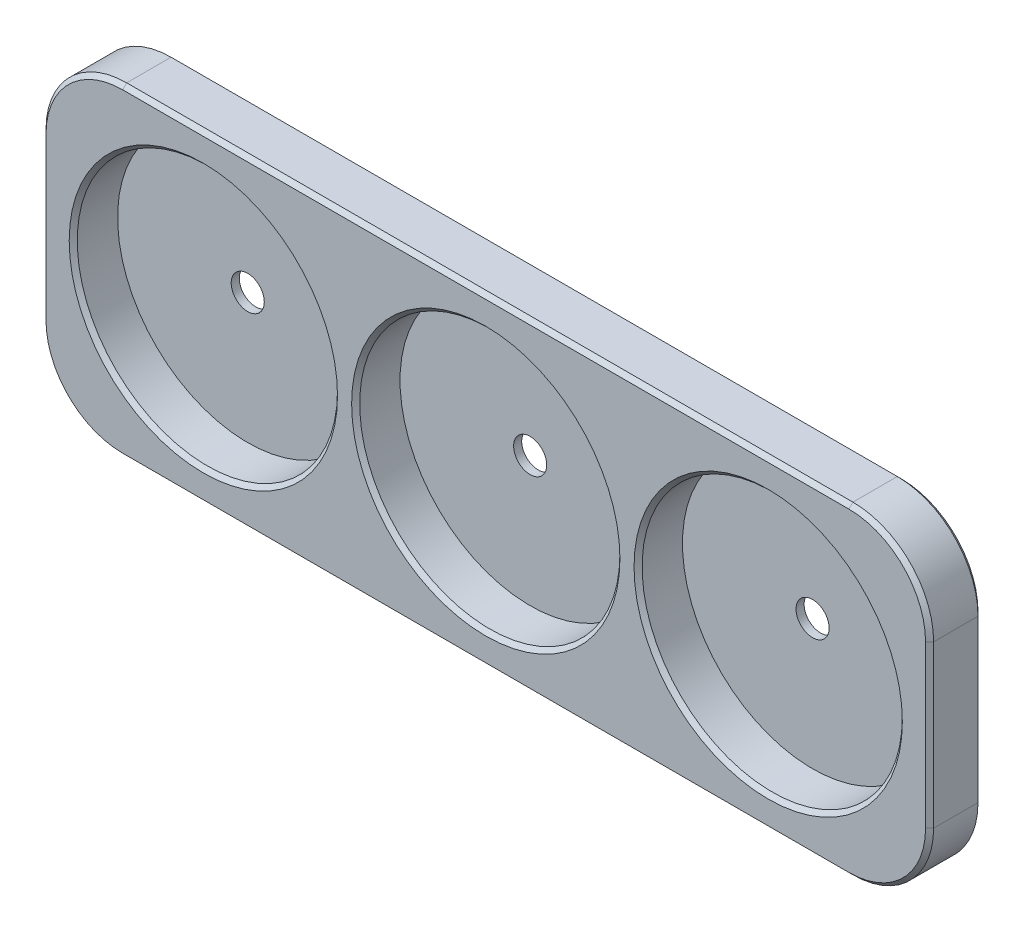
ISO-10303-21;
HEADER;
FILE_DESCRIPTION(('STEP AP214'),'2;1');
FILE_NAME('part.step','',(''),(''),'','','');
FILE_SCHEMA(('AUTOMOTIVE_DESIGN { 1 0 10303 214 1 1 1 1 }'));
ENDSEC;
DATA;
#1=APPLICATION_CONTEXT('core data for automotive mechanical design processes');
#2=APPLICATION_PROTOCOL_DEFINITION('international standard','automotive_design',2000,#1);
#3=PRODUCT_CONTEXT('',#1,'mechanical');
#4=PRODUCT('Part','Part','',(#3));
#5=PRODUCT_RELATED_PRODUCT_CATEGORY('part','',(#4));
#6=PRODUCT_DEFINITION_FORMATION('','',#4);
#7=PRODUCT_DEFINITION_CONTEXT('part definition',#1,'design');
#8=PRODUCT_DEFINITION('design','',#6,#7);
#9=PRODUCT_DEFINITION_SHAPE('','',#8);
#10=(LENGTH_UNIT() NAMED_UNIT(*) SI_UNIT(.MILLI.,.METRE.));
#11=(NAMED_UNIT(*) PLANE_ANGLE_UNIT() SI_UNIT($,.RADIAN.));
#12=(NAMED_UNIT(*) SI_UNIT($,.STERADIAN.) SOLID_ANGLE_UNIT());
#13=UNCERTAINTY_MEASURE_WITH_UNIT(LENGTH_MEASURE(1.E-05),#10,'distance_accuracy_value','');
#14=(GEOMETRIC_REPRESENTATION_CONTEXT(3) GLOBAL_UNCERTAINTY_ASSIGNED_CONTEXT((#13)) GLOBAL_UNIT_ASSIGNED_CONTEXT((#10,
#11,#12)) REPRESENTATION_CONTEXT('',''));
#15=CARTESIAN_POINT('',(0.,0.,0.));
#16=DIRECTION('',(0.,0.,1.));
#17=DIRECTION('',(1.,0.,0.));
#18=AXIS2_PLACEMENT_3D('',#15,#16,#17);
#19=CARTESIAN_POINT('',(55.,20.,6.5));
#20=DIRECTION('',(-1.,0.,0.));
#21=DIRECTION('',(0.,-1.,0.));
#22=AXIS2_PLACEMENT_3D('',#19,#20,#21);
#23=PLANE('',#22);
#24=DIRECTION('',(0.,0.,-1.));
#25=VECTOR('',#24,1.);
#26=CARTESIAN_POINT('',(55.,-10.,6.5));
#27=LINE('',#26,#25);
#28=CARTESIAN_POINT('',(55.,-10.,6.));
#29=VERTEX_POINT('',#28);
#30=CARTESIAN_POINT('',(55.,-10.,0.499999999999987));
#31=VERTEX_POINT('',#30);
#32=EDGE_CURVE('E375',#29,#31,#27,.T.);
#33=ORIENTED_EDGE('',*,*,#32,.T.);
#34=DIRECTION('',(0.,1.,0.));
#35=VECTOR('',#34,1.);
#36=CARTESIAN_POINT('',(55.,20.,0.499999999999987));
#37=LINE('',#36,#35);
#38=CARTESIAN_POINT('',(55.,10.,0.499999999999987));
#39=VERTEX_POINT('',#38);
#40=EDGE_CURVE('E257',#31,#39,#37,.T.);
#41=ORIENTED_EDGE('',*,*,#40,.T.);
#42=DIRECTION('',(0.,0.,-1.));
#43=VECTOR('',#42,1.);
#44=CARTESIAN_POINT('',(55.,10.,6.5));
#45=LINE('',#44,#43);
#46=CARTESIAN_POINT('',(55.,10.,6.));
#47=VERTEX_POINT('',#46);
#48=EDGE_CURVE('E379',#39,#47,#45,.F.);
#49=ORIENTED_EDGE('',*,*,#48,.T.);
#50=DIRECTION('',(0.,-1.,0.));
#51=VECTOR('',#50,1.);
#52=CARTESIAN_POINT('',(55.,-10.,6.));
#53=LINE('',#52,#51);
#54=EDGE_CURVE('E260',#47,#29,#53,.T.);
#55=ORIENTED_EDGE('',*,*,#54,.T.);
#56=EDGE_LOOP('',(#33,#41,#49,#55));
#57=FACE_BOUND('',#56,.T.);
#58=ADVANCED_FACE('F47',(#57),#23,.F.);
#59=CARTESIAN_POINT('',(-55.,20.,6.5));
#60=DIRECTION('',(0.,-1.,0.));
#61=DIRECTION('',(0.,0.,-1.));
#62=AXIS2_PLACEMENT_3D('',#59,#60,#61);
#63=PLANE('',#62);
#64=DIRECTION('',(0.,0.,-1.));
#65=VECTOR('',#64,1.);
#66=CARTESIAN_POINT('',(45.,20.,6.5));
#67=LINE('',#66,#65);
#68=CARTESIAN_POINT('',(45.,20.,6.));
#69=VERTEX_POINT('',#68);
#70=CARTESIAN_POINT('',(45.,20.,0.499999999999987));
#71=VERTEX_POINT('',#70);
#72=EDGE_CURVE('E361',#69,#71,#67,.T.);
#73=ORIENTED_EDGE('',*,*,#72,.T.);
#74=DIRECTION('',(-1.,0.,0.));
#75=VECTOR('',#74,1.);
#76=CARTESIAN_POINT('',(-55.,20.,0.499999999999987));
#77=LINE('',#76,#75);
#78=CARTESIAN_POINT('',(-45.,20.,0.499999999999987));
#79=VERTEX_POINT('',#78);
#80=EDGE_CURVE('E306',#71,#79,#77,.T.);
#81=ORIENTED_EDGE('',*,*,#80,.T.);
#82=DIRECTION('',(0.,0.,-1.));
#83=VECTOR('',#82,1.);
#84=CARTESIAN_POINT('',(-45.,20.,6.5));
#85=LINE('',#84,#83);
#86=CARTESIAN_POINT('',(-45.,20.,6.));
#87=VERTEX_POINT('',#86);
#88=EDGE_CURVE('E365',#79,#87,#85,.F.);
#89=ORIENTED_EDGE('',*,*,#88,.T.);
#90=DIRECTION('',(1.,0.,0.));
#91=VECTOR('',#90,1.);
#92=CARTESIAN_POINT('',(45.,20.,6.));
#93=LINE('',#92,#91);
#94=EDGE_CURVE('E310',#87,#69,#93,.T.);
#95=ORIENTED_EDGE('',*,*,#94,.T.);
#96=EDGE_LOOP('',(#73,#81,#89,#95));
#97=FACE_BOUND('',#96,.T.);
#98=ADVANCED_FACE('F443',(#97),#63,.F.);
#99=CARTESIAN_POINT('',(-55.,20.,6.5));
#100=DIRECTION('',(1.,0.,0.));
#101=DIRECTION('',(0.,1.,0.));
#102=AXIS2_PLACEMENT_3D('',#99,#100,#101);
#103=PLANE('',#102);
#104=DIRECTION('',(0.,0.,-1.));
#105=VECTOR('',#104,1.);
#106=CARTESIAN_POINT('',(-55.,10.,6.5));
#107=LINE('',#106,#105);
#108=CARTESIAN_POINT('',(-55.,10.,6.));
#109=VERTEX_POINT('',#108);
#110=CARTESIAN_POINT('',(-55.,10.,0.499999999999987));
#111=VERTEX_POINT('',#110);
#112=EDGE_CURVE('E353',#109,#111,#107,.T.);
#113=ORIENTED_EDGE('',*,*,#112,.T.);
#114=DIRECTION('',(0.,-1.,0.));
#115=VECTOR('',#114,1.);
#116=CARTESIAN_POINT('',(-55.,20.,0.499999999999987));
#117=LINE('',#116,#115);
#118=CARTESIAN_POINT('',(-55.,-10.,0.499999999999987));
#119=VERTEX_POINT('',#118);
#120=EDGE_CURVE('E263',#111,#119,#117,.T.);
#121=ORIENTED_EDGE('',*,*,#120,.T.);
#122=DIRECTION('',(0.,0.,-1.));
#123=VECTOR('',#122,1.);
#124=CARTESIAN_POINT('',(-55.,-10.,6.5));
#125=LINE('',#124,#123);
#126=CARTESIAN_POINT('',(-55.,-10.,6.));
#127=VERTEX_POINT('',#126);
#128=EDGE_CURVE('E357',#119,#127,#125,.F.);
#129=ORIENTED_EDGE('',*,*,#128,.T.);
#130=DIRECTION('',(0.,1.,0.));
#131=VECTOR('',#130,1.);
#132=CARTESIAN_POINT('',(-55.,10.,6.));
#133=LINE('',#132,#131);
#134=EDGE_CURVE('E266',#127,#109,#133,.T.);
#135=ORIENTED_EDGE('',*,*,#134,.T.);
#136=EDGE_LOOP('',(#113,#121,#129,#135));
#137=FACE_BOUND('',#136,.T.);
#138=ADVANCED_FACE('F450',(#137),#103,.F.);
#139=CARTESIAN_POINT('',(-55.,-20.,6.5));
#140=DIRECTION('',(0.,1.,0.));
#141=DIRECTION('',(0.,0.,1.));
#142=AXIS2_PLACEMENT_3D('',#139,#140,#141);
#143=PLANE('',#142);
#144=DIRECTION('',(0.,0.,-1.));
#145=VECTOR('',#144,1.);
#146=CARTESIAN_POINT('',(-45.,-20.,6.5));
#147=LINE('',#146,#145);
#148=CARTESIAN_POINT('',(-45.,-20.,6.));
#149=VERTEX_POINT('',#148);
#150=CARTESIAN_POINT('',(-45.,-20.,0.499999999999987));
#151=VERTEX_POINT('',#150);
#152=EDGE_CURVE('E372',#149,#151,#147,.T.);
#153=ORIENTED_EDGE('',*,*,#152,.T.);
#154=DIRECTION('',(1.,0.,0.));
#155=VECTOR('',#154,1.);
#156=CARTESIAN_POINT('',(-55.,-20.,0.499999999999987));
#157=LINE('',#156,#155);
#158=CARTESIAN_POINT('',(45.,-20.,0.499999999999987));
#159=VERTEX_POINT('',#158);
#160=EDGE_CURVE('E11',#151,#159,#157,.T.);
#161=ORIENTED_EDGE('',*,*,#160,.T.);
#162=DIRECTION('',(0.,0.,-1.));
#163=VECTOR('',#162,1.);
#164=CARTESIAN_POINT('',(45.,-20.,6.5));
#165=LINE('',#164,#163);
#166=CARTESIAN_POINT('',(45.,-20.,6.));
#167=VERTEX_POINT('',#166);
#168=EDGE_CURVE('E369',#159,#167,#165,.F.);
#169=ORIENTED_EDGE('',*,*,#168,.T.);
#170=DIRECTION('',(-1.,0.,0.));
#171=VECTOR('',#170,1.);
#172=CARTESIAN_POINT('',(-45.,-20.,6.));
#173=LINE('',#172,#171);
#174=EDGE_CURVE('E58',#167,#149,#173,.T.);
#175=ORIENTED_EDGE('',*,*,#174,.T.);
#176=EDGE_LOOP('',(#153,#161,#169,#175));
#177=FACE_BOUND('',#176,.T.);
#178=ADVANCED_FACE('F632',(#177),#143,.F.);
#179=CARTESIAN_POINT('',(0.,0.,6.5));
#180=DIRECTION('',(0.,0.,1.));
#181=DIRECTION('',(1.,0.,0.));
#182=AXIS2_PLACEMENT_3D('',#179,#180,#181);
#183=PLANE('',#182);
#184=CARTESIAN_POINT('',(35.,0.,6.5));
#185=DIRECTION('',(0.,0.,1.));
#186=DIRECTION('',(1.,0.,0.));
#187=AXIS2_PLACEMENT_3D('',#184,#185,#186);
#188=CIRCLE('',#187,16.625);
#189=CARTESIAN_POINT('',(51.625,0.,6.5));
#190=VERTEX_POINT('',#189);
#191=EDGE_CURVE('E322',#190,#190,#188,.F.);
#192=ORIENTED_EDGE('',*,*,#191,.T.);
#193=EDGE_LOOP('',(#192));
#194=FACE_BOUND('',#193,.T.);
#195=CARTESIAN_POINT('',(0.,0.,6.5));
#196=DIRECTION('',(0.,0.,1.));
#197=DIRECTION('',(1.,0.,0.));
#198=AXIS2_PLACEMENT_3D('',#195,#196,#197);
#199=CIRCLE('',#198,16.625);
#200=CARTESIAN_POINT('',(16.625,0.,6.5));
#201=VERTEX_POINT('',#200);
#202=EDGE_CURVE('E326',#201,#201,#199,.F.);
#203=ORIENTED_EDGE('',*,*,#202,.T.);
#204=EDGE_LOOP('',(#203));
#205=FACE_BOUND('',#204,.T.);
#206=CARTESIAN_POINT('',(-35.,0.,6.5));
#207=DIRECTION('',(0.,0.,1.));
#208=DIRECTION('',(1.,0.,0.));
#209=AXIS2_PLACEMENT_3D('',#206,#207,#208);
#210=CIRCLE('',#209,16.625);
#211=CARTESIAN_POINT('',(-18.375,0.,6.5));
#212=VERTEX_POINT('',#211);
#213=EDGE_CURVE('E330',#212,#212,#210,.F.);
#214=ORIENTED_EDGE('',*,*,#213,.T.);
#215=EDGE_LOOP('',(#214));
#216=FACE_BOUND('',#215,.T.);
#217=CARTESIAN_POINT('',(45.,10.,6.5));
#218=DIRECTION('',(0.,0.,1.));
#219=DIRECTION('',(1.,0.,0.));
#220=AXIS2_PLACEMENT_3D('',#217,#218,#219);
#221=CIRCLE('',#220,9.5);
#222=CARTESIAN_POINT('',(54.5,10.,6.5));
#223=VERTEX_POINT('',#222);
#224=CARTESIAN_POINT('',(45.,19.5,6.5));
#225=VERTEX_POINT('',#224);
#226=EDGE_CURVE('E341',#223,#225,#221,.T.);
#227=ORIENTED_EDGE('',*,*,#226,.T.);
#228=DIRECTION('',(-1.,0.,0.));
#229=VECTOR('',#228,1.);
#230=CARTESIAN_POINT('',(-45.,19.5,6.5));
#231=LINE('',#230,#229);
#232=CARTESIAN_POINT('',(-45.,19.5,6.5));
#233=VERTEX_POINT('',#232);
#234=EDGE_CURVE('E334',#225,#233,#231,.T.);
#235=ORIENTED_EDGE('',*,*,#234,.T.);
#236=CARTESIAN_POINT('',(-45.,10.,6.5));
#237=DIRECTION('',(0.,0.,1.));
#238=DIRECTION('',(1.,0.,0.));
#239=AXIS2_PLACEMENT_3D('',#236,#237,#238);
#240=CIRCLE('',#239,9.5);
#241=CARTESIAN_POINT('',(-54.5,10.,6.5));
#242=VERTEX_POINT('',#241);
#243=EDGE_CURVE('E338',#233,#242,#240,.T.);
#244=ORIENTED_EDGE('',*,*,#243,.T.);
#245=DIRECTION('',(0.,-1.,0.));
#246=VECTOR('',#245,1.);
#247=CARTESIAN_POINT('',(-54.5,-10.,6.5));
#248=LINE('',#247,#246);
#249=CARTESIAN_POINT('',(-54.5,-10.,6.5));
#250=VERTEX_POINT('',#249);
#251=EDGE_CURVE('E169',#242,#250,#248,.T.);
#252=ORIENTED_EDGE('',*,*,#251,.T.);
#253=CARTESIAN_POINT('',(-45.,-10.,6.5));
#254=DIRECTION('',(0.,0.,1.));
#255=DIRECTION('',(1.,0.,0.));
#256=AXIS2_PLACEMENT_3D('',#253,#254,#255);
#257=CIRCLE('',#256,9.5);
#258=CARTESIAN_POINT('',(-45.,-19.5,6.5));
#259=VERTEX_POINT('',#258);
#260=EDGE_CURVE('E163',#250,#259,#257,.T.);
#261=ORIENTED_EDGE('',*,*,#260,.T.);
#262=DIRECTION('',(1.,0.,0.));
#263=VECTOR('',#262,1.);
#264=CARTESIAN_POINT('',(45.,-19.5,6.5));
#265=LINE('',#264,#263);
#266=CARTESIAN_POINT('',(45.,-19.5,6.5));
#267=VERTEX_POINT('',#266);
#268=EDGE_CURVE('E166',#259,#267,#265,.T.);
#269=ORIENTED_EDGE('',*,*,#268,.T.);
#270=CARTESIAN_POINT('',(45.,-10.,6.5));
#271=DIRECTION('',(0.,0.,1.));
#272=DIRECTION('',(1.,0.,0.));
#273=AXIS2_PLACEMENT_3D('',#270,#271,#272);
#274=CIRCLE('',#273,9.49999999999999);
#275=CARTESIAN_POINT('',(54.5,-10.,6.5));
#276=VERTEX_POINT('',#275);
#277=EDGE_CURVE('E176',#267,#276,#274,.T.);
#278=ORIENTED_EDGE('',*,*,#277,.T.);
#279=DIRECTION('',(0.,1.,0.));
#280=VECTOR('',#279,1.);
#281=CARTESIAN_POINT('',(54.5,10.,6.5));
#282=LINE('',#281,#280);
#283=EDGE_CURVE('E175',#276,#223,#282,.T.);
#284=ORIENTED_EDGE('',*,*,#283,.T.);
#285=EDGE_LOOP('',(#227,#235,#244,#252,#261,#269,#278,#284));
#286=FACE_BOUND('',#285,.T.);
#287=ADVANCED_FACE('F165',(#194,#205,#216,#286),#183,.T.);
#288=CARTESIAN_POINT('',(0.,0.,0.));
#289=DIRECTION('',(0.,0.,1.));
#290=DIRECTION('',(1.,0.,0.));
#291=AXIS2_PLACEMENT_3D('',#288,#289,#290);
#292=PLANE('',#291);
#293=CARTESIAN_POINT('',(-45.,10.,0.));
#294=DIRECTION('',(0.,0.,1.));
#295=DIRECTION('',(1.,0.,0.));
#296=AXIS2_PLACEMENT_3D('',#293,#294,#295);
#297=CIRCLE('',#296,9.50000000000001);
#298=CARTESIAN_POINT('',(-54.5,10.,0.));
#299=VERTEX_POINT('',#298);
#300=CARTESIAN_POINT('',(-45.,19.5,0.));
#301=VERTEX_POINT('',#300);
#302=EDGE_CURVE('E285',#299,#301,#297,.F.);
#303=ORIENTED_EDGE('',*,*,#302,.T.);
#304=DIRECTION('',(1.,0.,0.));
#305=VECTOR('',#304,1.);
#306=CARTESIAN_POINT('',(0.,19.5,0.));
#307=LINE('',#306,#305);
#308=CARTESIAN_POINT('',(45.,19.5,0.));
#309=VERTEX_POINT('',#308);
#310=EDGE_CURVE('E281',#301,#309,#307,.T.);
#311=ORIENTED_EDGE('',*,*,#310,.T.);
#312=CARTESIAN_POINT('',(45.,10.,0.));
#313=DIRECTION('',(0.,0.,1.));
#314=DIRECTION('',(1.,0.,0.));
#315=AXIS2_PLACEMENT_3D('',#312,#313,#314);
#316=CIRCLE('',#315,9.50000000000002);
#317=CARTESIAN_POINT('',(54.5,10.,0.));
#318=VERTEX_POINT('',#317);
#319=EDGE_CURVE('E288',#309,#318,#316,.F.);
#320=ORIENTED_EDGE('',*,*,#319,.T.);
#321=DIRECTION('',(0.,-1.,0.));
#322=VECTOR('',#321,1.);
#323=CARTESIAN_POINT('',(54.5,0.,0.));
#324=LINE('',#323,#322);
#325=CARTESIAN_POINT('',(54.5,-10.,0.));
#326=VERTEX_POINT('',#325);
#327=EDGE_CURVE('E294',#318,#326,#324,.T.);
#328=ORIENTED_EDGE('',*,*,#327,.T.);
#329=CARTESIAN_POINT('',(45.,-10.,0.));
#330=DIRECTION('',(0.,0.,1.));
#331=DIRECTION('',(1.,0.,0.));
#332=AXIS2_PLACEMENT_3D('',#329,#330,#331);
#333=CIRCLE('',#332,9.50000000000001);
#334=CARTESIAN_POINT('',(45.,-19.5,0.));
#335=VERTEX_POINT('',#334);
#336=EDGE_CURVE('E300',#326,#335,#333,.F.);
#337=ORIENTED_EDGE('',*,*,#336,.T.);
#338=DIRECTION('',(-1.,0.,0.));
#339=VECTOR('',#338,1.);
#340=CARTESIAN_POINT('',(0.,-19.5,0.));
#341=LINE('',#340,#339);
#342=CARTESIAN_POINT('',(-45.,-19.5,0.));
#343=VERTEX_POINT('',#342);
#344=EDGE_CURVE('E303',#335,#343,#341,.T.);
#345=ORIENTED_EDGE('',*,*,#344,.T.);
#346=CARTESIAN_POINT('',(-45.,-10.,0.));
#347=DIRECTION('',(0.,0.,1.));
#348=DIRECTION('',(1.,0.,0.));
#349=AXIS2_PLACEMENT_3D('',#346,#347,#348);
#350=CIRCLE('',#349,9.50000000000002);
#351=CARTESIAN_POINT('',(-54.5,-10.,0.));
#352=VERTEX_POINT('',#351);
#353=EDGE_CURVE('E297',#343,#352,#350,.F.);
#354=ORIENTED_EDGE('',*,*,#353,.T.);
#355=DIRECTION('',(0.,1.,0.));
#356=VECTOR('',#355,1.);
#357=CARTESIAN_POINT('',(-54.5,0.,0.));
#358=LINE('',#357,#356);
#359=EDGE_CURVE('E291',#352,#299,#358,.T.);
#360=ORIENTED_EDGE('',*,*,#359,.T.);
#361=EDGE_LOOP('',(#303,#311,#320,#328,#337,#345,#354,#360));
#362=FACE_BOUND('',#361,.T.);
#363=CARTESIAN_POINT('',(-35.,0.,0.));
#364=DIRECTION('',(0.,0.,1.));
#365=DIRECTION('',(1.,0.,0.));
#366=AXIS2_PLACEMENT_3D('',#363,#364,#365);
#367=CIRCLE('',#366,2.04999999999999);
#368=CARTESIAN_POINT('',(-32.95,0.,0.));
#369=VERTEX_POINT('',#368);
#370=EDGE_CURVE('E219',#369,#369,#367,.T.);
#371=ORIENTED_EDGE('',*,*,#370,.T.);
#372=EDGE_LOOP('',(#371));
#373=FACE_BOUND('',#372,.T.);
#374=CARTESIAN_POINT('',(35.,0.,0.));
#375=DIRECTION('',(0.,0.,1.));
#376=DIRECTION('',(1.,0.,0.));
#377=AXIS2_PLACEMENT_3D('',#374,#375,#376);
#378=CIRCLE('',#377,2.04999999999999);
#379=CARTESIAN_POINT('',(37.05,0.,0.));
#380=VERTEX_POINT('',#379);
#381=EDGE_CURVE('E411',#380,#380,#378,.T.);
#382=ORIENTED_EDGE('',*,*,#381,.T.);
#383=EDGE_LOOP('',(#382));
#384=FACE_BOUND('',#383,.T.);
#385=CARTESIAN_POINT('',(0.,0.,0.));
#386=DIRECTION('',(0.,0.,1.));
#387=DIRECTION('',(1.,0.,0.));
#388=AXIS2_PLACEMENT_3D('',#385,#386,#387);
#389=CIRCLE('',#388,2.05);
#390=CARTESIAN_POINT('',(2.05,0.,0.));
#391=VERTEX_POINT('',#390);
#392=EDGE_CURVE('E392',#391,#391,#389,.T.);
#393=ORIENTED_EDGE('',*,*,#392,.T.);
#394=EDGE_LOOP('',(#393));
#395=FACE_BOUND('',#394,.T.);
#396=ADVANCED_FACE('F644',(#362,#373,#384,#395),#292,.F.);
#397=CARTESIAN_POINT('',(0.,0.,1.));
#398=DIRECTION('',(0.,0.,1.));
#399=DIRECTION('',(1.,0.,0.));
#400=AXIS2_PLACEMENT_3D('',#397,#398,#399);
#401=CYLINDRICAL_SURFACE('',#400,16.125);
#402=CARTESIAN_POINT('',(0.,0.,5.99999999999997));
#403=DIRECTION('',(0.,0.,1.));
#404=DIRECTION('',(1.,0.,0.));
#405=AXIS2_PLACEMENT_3D('',#402,#403,#404);
#406=CIRCLE('',#405,16.125);
#407=CARTESIAN_POINT('',(16.125,0.,5.99999999999997));
#408=VERTEX_POINT('',#407);
#409=EDGE_CURVE('E318',#408,#408,#406,.T.);
#410=ORIENTED_EDGE('',*,*,#409,.T.);
#411=EDGE_LOOP('',(#410));
#412=FACE_BOUND('',#411,.T.);
#413=CARTESIAN_POINT('',(0.,0.,1.));
#414=DIRECTION('',(0.,0.,1.));
#415=DIRECTION('',(1.,0.,0.));
#416=AXIS2_PLACEMENT_3D('',#413,#414,#415);
#417=CIRCLE('',#416,16.125);
#418=CARTESIAN_POINT('',(16.125,0.,1.));
#419=VERTEX_POINT('',#418);
#420=EDGE_CURVE('E383',#419,#419,#417,.T.);
#421=ORIENTED_EDGE('',*,*,#420,.F.);
#422=EDGE_LOOP('',(#421));
#423=FACE_BOUND('',#422,.T.);
#424=ADVANCED_FACE('F438',(#412,#423),#401,.F.);
#425=CARTESIAN_POINT('',(0.,0.,1.));
#426=DIRECTION('',(0.,0.,1.));
#427=DIRECTION('',(1.,0.,0.));
#428=AXIS2_PLACEMENT_3D('',#425,#426,#427);
#429=PLANE('',#428);
#430=CARTESIAN_POINT('',(0.,0.,1.));
#431=DIRECTION('',(0.,0.,1.));
#432=DIRECTION('',(1.,0.,0.));
#433=AXIS2_PLACEMENT_3D('',#430,#431,#432);
#434=CIRCLE('',#433,2.05);
#435=CARTESIAN_POINT('',(2.05,0.,1.));
#436=VERTEX_POINT('',#435);
#437=EDGE_CURVE('E396',#436,#436,#434,.T.);
#438=ORIENTED_EDGE('',*,*,#437,.F.);
#439=EDGE_LOOP('',(#438));
#440=FACE_BOUND('',#439,.T.);
#441=ORIENTED_EDGE('',*,*,#420,.T.);
#442=EDGE_LOOP('',(#441));
#443=FACE_BOUND('',#442,.T.);
#444=ADVANCED_FACE('F430',(#440,#443),#429,.T.);
#445=CARTESIAN_POINT('',(35.,0.,1.));
#446=DIRECTION('',(0.,0.,1.));
#447=DIRECTION('',(1.,0.,0.));
#448=AXIS2_PLACEMENT_3D('',#445,#446,#447);
#449=CYLINDRICAL_SURFACE('',#448,16.125);
#450=CARTESIAN_POINT('',(35.,0.,5.99999999999999));
#451=DIRECTION('',(0.,0.,1.));
#452=DIRECTION('',(1.,0.,0.));
#453=AXIS2_PLACEMENT_3D('',#450,#451,#452);
#454=CIRCLE('',#453,16.125);
#455=CARTESIAN_POINT('',(51.125,0.,5.99999999999999));
#456=VERTEX_POINT('',#455);
#457=EDGE_CURVE('E186',#456,#456,#454,.T.);
#458=ORIENTED_EDGE('',*,*,#457,.T.);
#459=EDGE_LOOP('',(#458));
#460=FACE_BOUND('',#459,.T.);
#461=CARTESIAN_POINT('',(35.,0.,1.));
#462=DIRECTION('',(0.,0.,1.));
#463=DIRECTION('',(1.,0.,0.));
#464=AXIS2_PLACEMENT_3D('',#461,#462,#463);
#465=CIRCLE('',#464,16.125);
#466=CARTESIAN_POINT('',(51.125,0.,1.));
#467=VERTEX_POINT('',#466);
#468=EDGE_CURVE('E387',#467,#467,#465,.T.);
#469=ORIENTED_EDGE('',*,*,#468,.F.);
#470=EDGE_LOOP('',(#469));
#471=FACE_BOUND('',#470,.T.);
#472=ADVANCED_FACE('F425',(#460,#471),#449,.F.);
#473=CARTESIAN_POINT('',(35.,0.,1.));
#474=DIRECTION('',(0.,0.,1.));
#475=DIRECTION('',(1.,0.,0.));
#476=AXIS2_PLACEMENT_3D('',#473,#474,#475);
#477=PLANE('',#476);
#478=CARTESIAN_POINT('',(35.,0.,1.));
#479=DIRECTION('',(0.,0.,1.));
#480=DIRECTION('',(1.,0.,0.));
#481=AXIS2_PLACEMENT_3D('',#478,#479,#480);
#482=CIRCLE('',#481,2.04999999999999);
#483=CARTESIAN_POINT('',(37.05,0.,1.));
#484=VERTEX_POINT('',#483);
#485=EDGE_CURVE('E400',#484,#484,#482,.T.);
#486=ORIENTED_EDGE('',*,*,#485,.F.);
#487=EDGE_LOOP('',(#486));
#488=FACE_BOUND('',#487,.T.);
#489=ORIENTED_EDGE('',*,*,#468,.T.);
#490=EDGE_LOOP('',(#489));
#491=FACE_BOUND('',#490,.T.);
#492=ADVANCED_FACE('F421',(#488,#491),#477,.T.);
#493=CARTESIAN_POINT('',(-35.,0.,1.));
#494=DIRECTION('',(0.,0.,1.));
#495=DIRECTION('',(1.,0.,0.));
#496=AXIS2_PLACEMENT_3D('',#493,#494,#495);
#497=CYLINDRICAL_SURFACE('',#496,16.125);
#498=CARTESIAN_POINT('',(-35.,0.,5.99999999999998));
#499=DIRECTION('',(0.,0.,1.));
#500=DIRECTION('',(1.,0.,0.));
#501=AXIS2_PLACEMENT_3D('',#498,#499,#500);
#502=CIRCLE('',#501,16.125);
#503=CARTESIAN_POINT('',(-18.875,0.,5.99999999999998));
#504=VERTEX_POINT('',#503);
#505=EDGE_CURVE('E314',#504,#504,#502,.T.);
#506=ORIENTED_EDGE('',*,*,#505,.T.);
#507=EDGE_LOOP('',(#506));
#508=FACE_BOUND('',#507,.T.);
#509=CARTESIAN_POINT('',(-35.,0.,1.));
#510=DIRECTION('',(0.,0.,1.));
#511=DIRECTION('',(1.,0.,0.));
#512=AXIS2_PLACEMENT_3D('',#509,#510,#511);
#513=CIRCLE('',#512,16.125);
#514=CARTESIAN_POINT('',(-18.875,0.,1.));
#515=VERTEX_POINT('',#514);
#516=EDGE_CURVE('E388',#515,#515,#513,.T.);
#517=ORIENTED_EDGE('',*,*,#516,.F.);
#518=EDGE_LOOP('',(#517));
#519=FACE_BOUND('',#518,.T.);
#520=ADVANCED_FACE('F424',(#508,#519),#497,.F.);
#521=CARTESIAN_POINT('',(-35.,0.,1.));
#522=DIRECTION('',(0.,0.,1.));
#523=DIRECTION('',(1.,0.,0.));
#524=AXIS2_PLACEMENT_3D('',#521,#522,#523);
#525=PLANE('',#524);
#526=CARTESIAN_POINT('',(-35.,0.,1.));
#527=DIRECTION('',(0.,0.,1.));
#528=DIRECTION('',(1.,0.,0.));
#529=AXIS2_PLACEMENT_3D('',#526,#527,#528);
#530=CIRCLE('',#529,2.04999999999999);
#531=CARTESIAN_POINT('',(-32.95,0.,1.));
#532=VERTEX_POINT('',#531);
#533=EDGE_CURVE('E407',#532,#532,#530,.T.);
#534=ORIENTED_EDGE('',*,*,#533,.F.);
#535=EDGE_LOOP('',(#534));
#536=FACE_BOUND('',#535,.T.);
#537=ORIENTED_EDGE('',*,*,#516,.T.);
#538=EDGE_LOOP('',(#537));
#539=FACE_BOUND('',#538,.T.);
#540=ADVANCED_FACE('F459',(#536,#539),#525,.T.);
#541=CARTESIAN_POINT('',(45.,-10.,6.5));
#542=DIRECTION('',(0.,0.,-1.));
#543=DIRECTION('',(-1.,0.,0.));
#544=AXIS2_PLACEMENT_3D('',#541,#542,#543);
#545=CYLINDRICAL_SURFACE('',#544,10.);
#546=ORIENTED_EDGE('',*,*,#168,.F.);
#547=CARTESIAN_POINT('',(45.,-10.,0.499999999999987));
#548=DIRECTION('',(0.,0.,1.));
#549=DIRECTION('',(1.,0.,0.));
#550=AXIS2_PLACEMENT_3D('',#547,#548,#549);
#551=CIRCLE('',#550,10.);
#552=EDGE_CURVE('E247',#159,#31,#551,.T.);
#553=ORIENTED_EDGE('',*,*,#552,.T.);
#554=ORIENTED_EDGE('',*,*,#32,.F.);
#555=CARTESIAN_POINT('',(45.,-10.,6.));
#556=DIRECTION('',(0.,0.,1.));
#557=DIRECTION('',(1.,0.,0.));
#558=AXIS2_PLACEMENT_3D('',#555,#556,#557);
#559=CIRCLE('',#558,10.);
#560=EDGE_CURVE('E66',#29,#167,#559,.F.);
#561=ORIENTED_EDGE('',*,*,#560,.T.);
#562=EDGE_LOOP('',(#546,#553,#554,#561));
#563=FACE_BOUND('',#562,.T.);
#564=ADVANCED_FACE('F455',(#563),#545,.T.);
#565=CARTESIAN_POINT('',(45.,10.,6.5));
#566=DIRECTION('',(0.,0.,-1.));
#567=DIRECTION('',(-1.,0.,0.));
#568=AXIS2_PLACEMENT_3D('',#565,#566,#567);
#569=CYLINDRICAL_SURFACE('',#568,10.);
#570=ORIENTED_EDGE('',*,*,#48,.F.);
#571=CARTESIAN_POINT('',(45.,10.,0.499999999999987));
#572=DIRECTION('',(0.,0.,1.));
#573=DIRECTION('',(1.,0.,0.));
#574=AXIS2_PLACEMENT_3D('',#571,#572,#573);
#575=CIRCLE('',#574,10.);
#576=EDGE_CURVE('E269',#39,#71,#575,.T.);
#577=ORIENTED_EDGE('',*,*,#576,.T.);
#578=ORIENTED_EDGE('',*,*,#72,.F.);
#579=CARTESIAN_POINT('',(45.,10.,6.));
#580=DIRECTION('',(0.,0.,1.));
#581=DIRECTION('',(1.,0.,0.));
#582=AXIS2_PLACEMENT_3D('',#579,#580,#581);
#583=CIRCLE('',#582,10.);
#584=EDGE_CURVE('E272',#69,#47,#583,.F.);
#585=ORIENTED_EDGE('',*,*,#584,.T.);
#586=EDGE_LOOP('',(#570,#577,#578,#585));
#587=FACE_BOUND('',#586,.T.);
#588=ADVANCED_FACE('F458',(#587),#569,.T.);
#589=CARTESIAN_POINT('',(-45.,10.,6.5));
#590=DIRECTION('',(0.,0.,-1.));
#591=DIRECTION('',(-1.,0.,0.));
#592=AXIS2_PLACEMENT_3D('',#589,#590,#591);
#593=CYLINDRICAL_SURFACE('',#592,10.);
#594=ORIENTED_EDGE('',*,*,#88,.F.);
#595=CARTESIAN_POINT('',(-45.,10.,0.499999999999987));
#596=DIRECTION('',(0.,0.,1.));
#597=DIRECTION('',(1.,0.,0.));
#598=AXIS2_PLACEMENT_3D('',#595,#596,#597);
#599=CIRCLE('',#598,10.);
#600=EDGE_CURVE('E275',#79,#111,#599,.T.);
#601=ORIENTED_EDGE('',*,*,#600,.T.);
#602=ORIENTED_EDGE('',*,*,#112,.F.);
#603=CARTESIAN_POINT('',(-45.,10.,6.));
#604=DIRECTION('',(0.,0.,1.));
#605=DIRECTION('',(1.,0.,0.));
#606=AXIS2_PLACEMENT_3D('',#603,#604,#605);
#607=CIRCLE('',#606,10.);
#608=EDGE_CURVE('E278',#109,#87,#607,.F.);
#609=ORIENTED_EDGE('',*,*,#608,.T.);
#610=EDGE_LOOP('',(#594,#601,#602,#609));
#611=FACE_BOUND('',#610,.T.);
#612=ADVANCED_FACE('F462',(#611),#593,.T.);
#613=CARTESIAN_POINT('',(-45.,-10.,6.5));
#614=DIRECTION('',(0.,0.,-1.));
#615=DIRECTION('',(-1.,0.,0.));
#616=AXIS2_PLACEMENT_3D('',#613,#614,#615);
#617=CYLINDRICAL_SURFACE('',#616,10.);
#618=ORIENTED_EDGE('',*,*,#128,.F.);
#619=CARTESIAN_POINT('',(-45.,-10.,0.499999999999987));
#620=DIRECTION('',(0.,0.,1.));
#621=DIRECTION('',(1.,0.,0.));
#622=AXIS2_PLACEMENT_3D('',#619,#620,#621);
#623=CIRCLE('',#622,10.);
#624=EDGE_CURVE('E252',#119,#151,#623,.T.);
#625=ORIENTED_EDGE('',*,*,#624,.T.);
#626=ORIENTED_EDGE('',*,*,#152,.F.);
#627=CARTESIAN_POINT('',(-45.,-10.,6.));
#628=DIRECTION('',(0.,0.,1.));
#629=DIRECTION('',(1.,0.,0.));
#630=AXIS2_PLACEMENT_3D('',#627,#628,#629);
#631=CIRCLE('',#630,10.);
#632=EDGE_CURVE('E189',#149,#127,#631,.F.);
#633=ORIENTED_EDGE('',*,*,#632,.T.);
#634=EDGE_LOOP('',(#618,#625,#626,#633));
#635=FACE_BOUND('',#634,.T.);
#636=ADVANCED_FACE('F466',(#635),#617,.T.);
#637=CARTESIAN_POINT('',(-35.,0.,0.));
#638=DIRECTION('',(0.,0.,1.));
#639=DIRECTION('',(1.,0.,0.));
#640=AXIS2_PLACEMENT_3D('',#637,#638,#639);
#641=CYLINDRICAL_SURFACE('',#640,2.04999999999999);
#642=ORIENTED_EDGE('',*,*,#370,.F.);
#643=EDGE_LOOP('',(#642));
#644=FACE_BOUND('',#643,.T.);
#645=ORIENTED_EDGE('',*,*,#533,.T.);
#646=EDGE_LOOP('',(#645));
#647=FACE_BOUND('',#646,.T.);
#648=ADVANCED_FACE('F470',(#644,#647),#641,.F.);
#649=CARTESIAN_POINT('',(35.,0.,0.));
#650=DIRECTION('',(0.,0.,1.));
#651=DIRECTION('',(1.,0.,0.));
#652=AXIS2_PLACEMENT_3D('',#649,#650,#651);
#653=CYLINDRICAL_SURFACE('',#652,2.04999999999999);
#654=ORIENTED_EDGE('',*,*,#381,.F.);
#655=EDGE_LOOP('',(#654));
#656=FACE_BOUND('',#655,.T.);
#657=ORIENTED_EDGE('',*,*,#485,.T.);
#658=EDGE_LOOP('',(#657));
#659=FACE_BOUND('',#658,.T.);
#660=ADVANCED_FACE('F419',(#656,#659),#653,.F.);
#661=CARTESIAN_POINT('',(0.,0.,0.));
#662=DIRECTION('',(0.,0.,1.));
#663=DIRECTION('',(1.,0.,0.));
#664=AXIS2_PLACEMENT_3D('',#661,#662,#663);
#665=CYLINDRICAL_SURFACE('',#664,2.05);
#666=ORIENTED_EDGE('',*,*,#392,.F.);
#667=EDGE_LOOP('',(#666));
#668=FACE_BOUND('',#667,.T.);
#669=ORIENTED_EDGE('',*,*,#437,.T.);
#670=EDGE_LOOP('',(#669));
#671=FACE_BOUND('',#670,.T.);
#672=ADVANCED_FACE('F480',(#668,#671),#665,.F.);
#673=CARTESIAN_POINT('',(35.,0.,5.99999999999999));
#674=DIRECTION('',(0.,0.,1.));
#675=DIRECTION('',(1.,0.,0.));
#676=AXIS2_PLACEMENT_3D('',#673,#674,#675);
#677=CONICAL_SURFACE('',#676,16.125,0.785398163397462);
#678=ORIENTED_EDGE('',*,*,#191,.F.);
#679=EDGE_LOOP('',(#678));
#680=FACE_BOUND('',#679,.T.);
#681=ORIENTED_EDGE('',*,*,#457,.F.);
#682=EDGE_LOOP('',(#681));
#683=FACE_BOUND('',#682,.T.);
#684=ADVANCED_FACE('F473',(#680,#683),#677,.F.);
#685=CARTESIAN_POINT('',(0.,0.,5.99999999999997));
#686=DIRECTION('',(0.,0.,1.));
#687=DIRECTION('',(1.,0.,0.));
#688=AXIS2_PLACEMENT_3D('',#685,#686,#687);
#689=CONICAL_SURFACE('',#688,16.125,0.785398163397462);
#690=ORIENTED_EDGE('',*,*,#202,.F.);
#691=EDGE_LOOP('',(#690));
#692=FACE_BOUND('',#691,.T.);
#693=ORIENTED_EDGE('',*,*,#409,.F.);
#694=EDGE_LOOP('',(#693));
#695=FACE_BOUND('',#694,.T.);
#696=ADVANCED_FACE('F479',(#692,#695),#689,.F.);
#697=CARTESIAN_POINT('',(-35.,0.,5.99999999999998));
#698=DIRECTION('',(0.,0.,1.));
#699=DIRECTION('',(1.,0.,0.));
#700=AXIS2_PLACEMENT_3D('',#697,#698,#699);
#701=CONICAL_SURFACE('',#700,16.125,0.785398163397462);
#702=ORIENTED_EDGE('',*,*,#213,.F.);
#703=EDGE_LOOP('',(#702));
#704=FACE_BOUND('',#703,.T.);
#705=ORIENTED_EDGE('',*,*,#505,.F.);
#706=EDGE_LOOP('',(#705));
#707=FACE_BOUND('',#706,.T.);
#708=ADVANCED_FACE('F487',(#704,#707),#701,.F.);
#709=CARTESIAN_POINT('',(-55.,-20.,0.499999999999987));
#710=DIRECTION('',(0.,0.707106781186548,0.707106781186548));
#711=DIRECTION('',(1.,0.,0.));
#712=AXIS2_PLACEMENT_3D('',#709,#710,#711);
#713=PLANE('',#712);
#714=DIRECTION('',(0.,-0.707106781186548,0.707106781186548));
#715=VECTOR('',#714,1.);
#716=CARTESIAN_POINT('',(-45.,-19.5,0.));
#717=LINE('',#716,#715);
#718=EDGE_CURVE('E220',#343,#151,#717,.T.);
#719=ORIENTED_EDGE('',*,*,#718,.F.);
#720=ORIENTED_EDGE('',*,*,#344,.F.);
#721=DIRECTION('',(0.,0.707106781186548,-0.707106781186548));
#722=VECTOR('',#721,1.);
#723=CARTESIAN_POINT('',(45.,-20.,0.499999999999987));
#724=LINE('',#723,#722);
#725=EDGE_CURVE('E215',#159,#335,#724,.T.);
#726=ORIENTED_EDGE('',*,*,#725,.F.);
#727=ORIENTED_EDGE('',*,*,#160,.F.);
#728=EDGE_LOOP('',(#719,#720,#726,#727));
#729=FACE_BOUND('',#728,.T.);
#730=ADVANCED_FACE('F494',(#729),#713,.F.);
#731=CARTESIAN_POINT('',(45.,-10.,0.));
#732=DIRECTION('',(0.,0.,1.));
#733=DIRECTION('',(1.,0.,0.));
#734=AXIS2_PLACEMENT_3D('',#731,#732,#733);
#735=CONICAL_SURFACE('',#734,9.50000000000001,0.78539816339745);
#736=ORIENTED_EDGE('',*,*,#725,.T.);
#737=ORIENTED_EDGE('',*,*,#336,.F.);
#738=DIRECTION('',(-0.707106781186552,0.,-0.707106781186543));
#739=VECTOR('',#738,1.);
#740=CARTESIAN_POINT('',(55.,-10.,0.499999999999987));
#741=LINE('',#740,#739);
#742=EDGE_CURVE('E224',#31,#326,#741,.T.);
#743=ORIENTED_EDGE('',*,*,#742,.F.);
#744=ORIENTED_EDGE('',*,*,#552,.F.);
#745=EDGE_LOOP('',(#736,#737,#743,#744));
#746=FACE_BOUND('',#745,.T.);
#747=ADVANCED_FACE('F538',(#746),#735,.T.);
#748=CARTESIAN_POINT('',(-45.,-10.,0.));
#749=DIRECTION('',(0.,0.,1.));
#750=DIRECTION('',(1.,0.,0.));
#751=AXIS2_PLACEMENT_3D('',#748,#749,#750);
#752=CONICAL_SURFACE('',#751,9.50000000000002,0.785398163397447);
#753=ORIENTED_EDGE('',*,*,#718,.T.);
#754=ORIENTED_EDGE('',*,*,#624,.F.);
#755=DIRECTION('',(-0.707106781186548,0.,0.707106781186548));
#756=VECTOR('',#755,1.);
#757=CARTESIAN_POINT('',(-54.5,-10.,0.));
#758=LINE('',#757,#756);
#759=EDGE_CURVE('E228',#352,#119,#758,.T.);
#760=ORIENTED_EDGE('',*,*,#759,.F.);
#761=ORIENTED_EDGE('',*,*,#353,.F.);
#762=EDGE_LOOP('',(#753,#754,#760,#761));
#763=FACE_BOUND('',#762,.T.);
#764=ADVANCED_FACE('F531',(#763),#752,.T.);
#765=CARTESIAN_POINT('',(55.,20.,0.499999999999987));
#766=DIRECTION('',(-0.707106781186552,0.,0.707106781186543));
#767=DIRECTION('',(0.,1.,0.));
#768=AXIS2_PLACEMENT_3D('',#765,#766,#767);
#769=PLANE('',#768);
#770=ORIENTED_EDGE('',*,*,#742,.T.);
#771=ORIENTED_EDGE('',*,*,#327,.F.);
#772=DIRECTION('',(-0.707106781186538,0.,-0.707106781186557));
#773=VECTOR('',#772,1.);
#774=CARTESIAN_POINT('',(55.,10.,0.499999999999987));
#775=LINE('',#774,#773);
#776=EDGE_CURVE('E232',#39,#318,#775,.T.);
#777=ORIENTED_EDGE('',*,*,#776,.F.);
#778=ORIENTED_EDGE('',*,*,#40,.F.);
#779=EDGE_LOOP('',(#770,#771,#777,#778));
#780=FACE_BOUND('',#779,.T.);
#781=ADVANCED_FACE('F524',(#780),#769,.F.);
#782=CARTESIAN_POINT('',(-55.,20.,0.499999999999987));
#783=DIRECTION('',(0.70710678118655,0.,0.707106781186545));
#784=DIRECTION('',(0.,-1.,0.));
#785=AXIS2_PLACEMENT_3D('',#782,#783,#784);
#786=PLANE('',#785);
#787=ORIENTED_EDGE('',*,*,#759,.T.);
#788=ORIENTED_EDGE('',*,*,#120,.F.);
#789=DIRECTION('',(-0.707106781186548,0.,0.707106781186548));
#790=VECTOR('',#789,1.);
#791=CARTESIAN_POINT('',(-54.5,10.,0.));
#792=LINE('',#791,#790);
#793=EDGE_CURVE('E236',#299,#111,#792,.T.);
#794=ORIENTED_EDGE('',*,*,#793,.F.);
#795=ORIENTED_EDGE('',*,*,#359,.F.);
#796=EDGE_LOOP('',(#787,#788,#794,#795));
#797=FACE_BOUND('',#796,.T.);
#798=ADVANCED_FACE('F517',(#797),#786,.F.);
#799=CARTESIAN_POINT('',(45.,10.,0.));
#800=DIRECTION('',(0.,0.,1.));
#801=DIRECTION('',(1.,0.,0.));
#802=AXIS2_PLACEMENT_3D('',#799,#800,#801);
#803=CONICAL_SURFACE('',#802,9.50000000000002,0.785398163397447);
#804=ORIENTED_EDGE('',*,*,#776,.T.);
#805=ORIENTED_EDGE('',*,*,#319,.F.);
#806=DIRECTION('',(0.,-0.707106781186545,-0.70710678118655));
#807=VECTOR('',#806,1.);
#808=CARTESIAN_POINT('',(45.,20.,0.499999999999987));
#809=LINE('',#808,#807);
#810=EDGE_CURVE('E240',#71,#309,#809,.T.);
#811=ORIENTED_EDGE('',*,*,#810,.F.);
#812=ORIENTED_EDGE('',*,*,#576,.F.);
#813=EDGE_LOOP('',(#804,#805,#811,#812));
#814=FACE_BOUND('',#813,.T.);
#815=ADVANCED_FACE('F510',(#814),#803,.T.);
#816=CARTESIAN_POINT('',(-45.,10.,0.));
#817=DIRECTION('',(0.,0.,1.));
#818=DIRECTION('',(1.,0.,0.));
#819=AXIS2_PLACEMENT_3D('',#816,#817,#818);
#820=CONICAL_SURFACE('',#819,9.50000000000001,0.785398163397448);
#821=ORIENTED_EDGE('',*,*,#793,.T.);
#822=ORIENTED_EDGE('',*,*,#600,.F.);
#823=DIRECTION('',(0.,0.707106781186548,0.707106781186548));
#824=VECTOR('',#823,1.);
#825=CARTESIAN_POINT('',(-45.,19.5,0.));
#826=LINE('',#825,#824);
#827=EDGE_CURVE('E194',#301,#79,#826,.T.);
#828=ORIENTED_EDGE('',*,*,#827,.F.);
#829=ORIENTED_EDGE('',*,*,#302,.F.);
#830=EDGE_LOOP('',(#821,#822,#828,#829));
#831=FACE_BOUND('',#830,.T.);
#832=ADVANCED_FACE('F503',(#831),#820,.T.);
#833=CARTESIAN_POINT('',(-55.,20.,0.499999999999987));
#834=DIRECTION('',(0.,-0.707106781186548,0.707106781186548));
#835=DIRECTION('',(-1.,0.,0.));
#836=AXIS2_PLACEMENT_3D('',#833,#834,#835);
#837=PLANE('',#836);
#838=ORIENTED_EDGE('',*,*,#810,.T.);
#839=ORIENTED_EDGE('',*,*,#310,.F.);
#840=ORIENTED_EDGE('',*,*,#827,.T.);
#841=ORIENTED_EDGE('',*,*,#80,.F.);
#842=EDGE_LOOP('',(#838,#839,#840,#841));
#843=FACE_BOUND('',#842,.T.);
#844=ADVANCED_FACE('F497',(#843),#837,.F.);
#845=CARTESIAN_POINT('',(0.,-19.5,6.5));
#846=DIRECTION('',(0.,-0.707106781186547,0.707106781186547));
#847=DIRECTION('',(-1.,0.,0.));
#848=AXIS2_PLACEMENT_3D('',#845,#846,#847);
#849=PLANE('',#848);
#850=DIRECTION('',(0.,0.707106781186547,0.707106781186547));
#851=VECTOR('',#850,1.);
#852=CARTESIAN_POINT('',(-45.,-20.,6.));
#853=LINE('',#852,#851);
#854=EDGE_CURVE('E181',#149,#259,#853,.T.);
#855=ORIENTED_EDGE('',*,*,#854,.F.);
#856=ORIENTED_EDGE('',*,*,#174,.F.);
#857=DIRECTION('',(0.,-0.707106781186547,-0.707106781186547));
#858=VECTOR('',#857,1.);
#859=CARTESIAN_POINT('',(45.,-19.5,6.5));
#860=LINE('',#859,#858);
#861=EDGE_CURVE('E52',#267,#167,#860,.T.);
#862=ORIENTED_EDGE('',*,*,#861,.F.);
#863=ORIENTED_EDGE('',*,*,#268,.F.);
#864=EDGE_LOOP('',(#855,#856,#862,#863));
#865=FACE_BOUND('',#864,.T.);
#866=ADVANCED_FACE('F50',(#865),#849,.T.);
#867=CARTESIAN_POINT('',(45.,-10.,6.5));
#868=DIRECTION('',(0.,0.,-1.));
#869=DIRECTION('',(-1.,0.,0.));
#870=AXIS2_PLACEMENT_3D('',#867,#868,#869);
#871=CONICAL_SURFACE('',#870,9.5,0.78539816339745);
#872=ORIENTED_EDGE('',*,*,#861,.T.);
#873=ORIENTED_EDGE('',*,*,#560,.F.);
#874=DIRECTION('',(0.707106781186552,0.,-0.707106781186542));
#875=VECTOR('',#874,1.);
#876=CARTESIAN_POINT('',(54.5,-10.,6.5));
#877=LINE('',#876,#875);
#878=EDGE_CURVE('E191',#276,#29,#877,.T.);
#879=ORIENTED_EDGE('',*,*,#878,.F.);
#880=ORIENTED_EDGE('',*,*,#277,.F.);
#881=EDGE_LOOP('',(#872,#873,#879,#880));
#882=FACE_BOUND('',#881,.T.);
#883=ADVANCED_FACE('F590',(#882),#871,.T.);
#884=CARTESIAN_POINT('',(-45.,-10.,6.5));
#885=DIRECTION('',(0.,0.,-1.));
#886=DIRECTION('',(-1.,0.,0.));
#887=AXIS2_PLACEMENT_3D('',#884,#885,#886);
#888=CONICAL_SURFACE('',#887,9.5,0.785398163397447);
#889=ORIENTED_EDGE('',*,*,#854,.T.);
#890=ORIENTED_EDGE('',*,*,#260,.F.);
#891=DIRECTION('',(0.707106781186547,0.,0.707106781186547));
#892=VECTOR('',#891,1.);
#893=CARTESIAN_POINT('',(-55.,-10.,6.));
#894=LINE('',#893,#892);
#895=EDGE_CURVE('E196',#127,#250,#894,.T.);
#896=ORIENTED_EDGE('',*,*,#895,.F.);
#897=ORIENTED_EDGE('',*,*,#632,.F.);
#898=EDGE_LOOP('',(#889,#890,#896,#897));
#899=FACE_BOUND('',#898,.T.);
#900=ADVANCED_FACE('F188',(#899),#888,.T.);
#901=CARTESIAN_POINT('',(54.5,0.,6.5));
#902=DIRECTION('',(0.707106781186547,0.,0.707106781186547));
#903=DIRECTION('',(0.,-1.,0.));
#904=AXIS2_PLACEMENT_3D('',#901,#902,#903);
#905=PLANE('',#904);
#906=ORIENTED_EDGE('',*,*,#878,.T.);
#907=ORIENTED_EDGE('',*,*,#54,.F.);
#908=DIRECTION('',(0.707106781186543,0.,-0.707106781186552));
#909=VECTOR('',#908,1.);
#910=CARTESIAN_POINT('',(54.5,10.,6.5));
#911=LINE('',#910,#909);
#912=EDGE_CURVE('E201',#223,#47,#911,.T.);
#913=ORIENTED_EDGE('',*,*,#912,.F.);
#914=ORIENTED_EDGE('',*,*,#283,.F.);
#915=EDGE_LOOP('',(#906,#907,#913,#914));
#916=FACE_BOUND('',#915,.T.);
#917=ADVANCED_FACE('F578',(#916),#905,.T.);
#918=CARTESIAN_POINT('',(-54.5,0.,6.5));
#919=DIRECTION('',(-0.70710678118655,0.,0.707106781186545));
#920=DIRECTION('',(0.,1.,0.));
#921=AXIS2_PLACEMENT_3D('',#918,#919,#920);
#922=PLANE('',#921);
#923=ORIENTED_EDGE('',*,*,#895,.T.);
#924=ORIENTED_EDGE('',*,*,#251,.F.);
#925=DIRECTION('',(0.707106781186543,0.,0.707106781186552));
#926=VECTOR('',#925,1.);
#927=CARTESIAN_POINT('',(-55.,10.,6.));
#928=LINE('',#927,#926);
#929=EDGE_CURVE('E205',#109,#242,#928,.T.);
#930=ORIENTED_EDGE('',*,*,#929,.F.);
#931=ORIENTED_EDGE('',*,*,#134,.F.);
#932=EDGE_LOOP('',(#923,#924,#930,#931));
#933=FACE_BOUND('',#932,.T.);
#934=ADVANCED_FACE('F571',(#933),#922,.T.);
#935=CARTESIAN_POINT('',(45.,10.,6.5));
#936=DIRECTION('',(0.,0.,-1.));
#937=DIRECTION('',(-1.,0.,0.));
#938=AXIS2_PLACEMENT_3D('',#935,#936,#937);
#939=CONICAL_SURFACE('',#938,9.5,0.785398163397447);
#940=ORIENTED_EDGE('',*,*,#912,.T.);
#941=ORIENTED_EDGE('',*,*,#584,.F.);
#942=DIRECTION('',(0.,0.707106781186545,-0.70710678118655));
#943=VECTOR('',#942,1.);
#944=CARTESIAN_POINT('',(45.,19.5,6.5));
#945=LINE('',#944,#943);
#946=EDGE_CURVE('E209',#225,#69,#945,.T.);
#947=ORIENTED_EDGE('',*,*,#946,.F.);
#948=ORIENTED_EDGE('',*,*,#226,.F.);
#949=EDGE_LOOP('',(#940,#941,#947,#948));
#950=FACE_BOUND('',#949,.T.);
#951=ADVANCED_FACE('F564',(#950),#939,.T.);
#952=CARTESIAN_POINT('',(-45.,10.,6.5));
#953=DIRECTION('',(0.,0.,-1.));
#954=DIRECTION('',(-1.,0.,0.));
#955=AXIS2_PLACEMENT_3D('',#952,#953,#954);
#956=CONICAL_SURFACE('',#955,9.5,0.785398163397448);
#957=ORIENTED_EDGE('',*,*,#929,.T.);
#958=ORIENTED_EDGE('',*,*,#243,.F.);
#959=DIRECTION('',(0.,-0.707106781186545,0.70710678118655));
#960=VECTOR('',#959,1.);
#961=CARTESIAN_POINT('',(-45.,20.,6.));
#962=LINE('',#961,#960);
#963=EDGE_CURVE('E212',#87,#233,#962,.T.);
#964=ORIENTED_EDGE('',*,*,#963,.F.);
#965=ORIENTED_EDGE('',*,*,#608,.F.);
#966=EDGE_LOOP('',(#957,#958,#964,#965));
#967=FACE_BOUND('',#966,.T.);
#968=ADVANCED_FACE('F557',(#967),#956,.T.);
#969=CARTESIAN_POINT('',(0.,19.5,6.5));
#970=DIRECTION('',(0.,0.707106781186547,0.707106781186547));
#971=DIRECTION('',(1.,0.,0.));
#972=AXIS2_PLACEMENT_3D('',#969,#970,#971);
#973=PLANE('',#972);
#974=ORIENTED_EDGE('',*,*,#946,.T.);
#975=ORIENTED_EDGE('',*,*,#94,.F.);
#976=ORIENTED_EDGE('',*,*,#963,.T.);
#977=ORIENTED_EDGE('',*,*,#234,.F.);
#978=EDGE_LOOP('',(#974,#975,#976,#977));
#979=FACE_BOUND('',#978,.T.);
#980=ADVANCED_FACE('F551',(#979),#973,.T.);
#981=CLOSED_SHELL('',(#58,#98,#138,#178,#287,#396,#424,#444,#472,#492,#520,#540,#564,#588,#612,
#636,#648,#660,#672,#684,#696,#708,#730,#747,#764,#781,#798,#815,#832,#844,#866,#883,#900,#917,
#934,#951,#968,#980));
#982=MANIFOLD_SOLID_BREP('B2',#981);
#983=ADVANCED_BREP_SHAPE_REPRESENTATION('',(#18,#982),#14);
#984=SHAPE_DEFINITION_REPRESENTATION(#9,#983);
ENDSEC;
END-ISO-10303-21;
